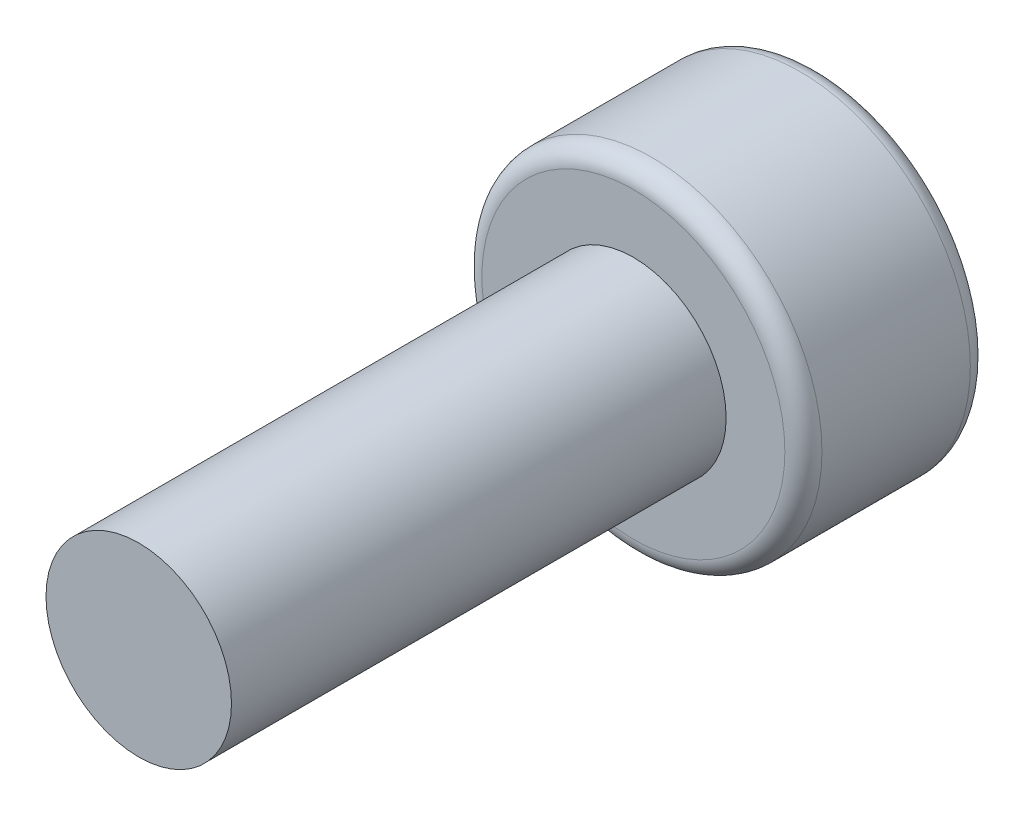
ISO-10303-21;
HEADER;
FILE_DESCRIPTION(('STEP AP214'),'2;1');
FILE_NAME('part.step','',(''),(''),'','','');
FILE_SCHEMA(('AUTOMOTIVE_DESIGN { 1 0 10303 214 1 1 1 1 }'));
ENDSEC;
DATA;
#1=APPLICATION_CONTEXT('core data for automotive mechanical design processes');
#2=APPLICATION_PROTOCOL_DEFINITION('international standard','automotive_design',2000,#1);
#3=PRODUCT_CONTEXT('',#1,'mechanical');
#4=PRODUCT('Part','Part','',(#3));
#5=PRODUCT_RELATED_PRODUCT_CATEGORY('part','',(#4));
#6=PRODUCT_DEFINITION_FORMATION('','',#4);
#7=PRODUCT_DEFINITION_CONTEXT('part definition',#1,'design');
#8=PRODUCT_DEFINITION('design','',#6,#7);
#9=PRODUCT_DEFINITION_SHAPE('','',#8);
#10=(LENGTH_UNIT() NAMED_UNIT(*) SI_UNIT(.MILLI.,.METRE.));
#11=(NAMED_UNIT(*) PLANE_ANGLE_UNIT() SI_UNIT($,.RADIAN.));
#12=(NAMED_UNIT(*) SI_UNIT($,.STERADIAN.) SOLID_ANGLE_UNIT());
#13=UNCERTAINTY_MEASURE_WITH_UNIT(LENGTH_MEASURE(1.E-05),#10,'distance_accuracy_value','');
#14=(GEOMETRIC_REPRESENTATION_CONTEXT(3) GLOBAL_UNCERTAINTY_ASSIGNED_CONTEXT((#13)) GLOBAL_UNIT_ASSIGNED_CONTEXT((#10,
#11,#12)) REPRESENTATION_CONTEXT('',''));
#15=CARTESIAN_POINT('',(0.,0.,0.));
#16=DIRECTION('',(0.,0.,1.));
#17=DIRECTION('',(1.,0.,0.));
#18=AXIS2_PLACEMENT_3D('',#15,#16,#17);
#19=CARTESIAN_POINT('',(0.,0.,3.));
#20=DIRECTION('',(0.,0.,-1.));
#21=DIRECTION('',(-1.,0.,0.));
#22=AXIS2_PLACEMENT_3D('',#19,#20,#21);
#23=CYLINDRICAL_SURFACE('',#22,2.75);
#24=CARTESIAN_POINT('',(0.,0.,0.3));
#25=DIRECTION('',(0.,0.,1.));
#26=DIRECTION('',(1.,0.,0.));
#27=AXIS2_PLACEMENT_3D('',#24,#25,#26);
#28=CIRCLE('',#27,2.75);
#29=CARTESIAN_POINT('',(2.75,0.,0.3));
#30=VERTEX_POINT('',#29);
#31=EDGE_CURVE('E155',#30,#30,#28,.T.);
#32=ORIENTED_EDGE('',*,*,#31,.T.);
#33=EDGE_LOOP('',(#32));
#34=FACE_BOUND('',#33,.T.);
#35=CARTESIAN_POINT('',(0.,0.,2.7));
#36=DIRECTION('',(0.,0.,1.));
#37=DIRECTION('',(1.,0.,0.));
#38=AXIS2_PLACEMENT_3D('',#35,#36,#37);
#39=CIRCLE('',#38,2.75);
#40=CARTESIAN_POINT('',(2.75,0.,2.7));
#41=VERTEX_POINT('',#40);
#42=EDGE_CURVE('E152',#41,#41,#39,.F.);
#43=ORIENTED_EDGE('',*,*,#42,.T.);
#44=EDGE_LOOP('',(#43));
#45=FACE_BOUND('',#44,.T.);
#46=ADVANCED_FACE('F39',(#34,#45),#23,.T.);
#47=CARTESIAN_POINT('',(0.,0.,3.));
#48=DIRECTION('',(0.,0.,1.));
#49=DIRECTION('',(1.,0.,0.));
#50=AXIS2_PLACEMENT_3D('',#47,#48,#49);
#51=PLANE('',#50);
#52=CARTESIAN_POINT('',(0.,0.,3.));
#53=DIRECTION('',(0.,0.,1.));
#54=DIRECTION('',(1.,0.,0.));
#55=AXIS2_PLACEMENT_3D('',#52,#53,#54);
#56=CIRCLE('',#55,2.45);
#57=CARTESIAN_POINT('',(2.45,0.,3.));
#58=VERTEX_POINT('',#57);
#59=EDGE_CURVE('E11',#58,#58,#56,.T.);
#60=ORIENTED_EDGE('',*,*,#59,.T.);
#61=EDGE_LOOP('',(#60));
#62=FACE_BOUND('',#61,.T.);
#63=CARTESIAN_POINT('',(0.,0.,3.));
#64=DIRECTION('',(0.,0.,1.));
#65=DIRECTION('',(1.,0.,0.));
#66=AXIS2_PLACEMENT_3D('',#63,#64,#65);
#67=CIRCLE('',#66,1.5);
#68=CARTESIAN_POINT('',(1.5,0.,3.));
#69=VERTEX_POINT('',#68);
#70=EDGE_CURVE('E149',#69,#69,#67,.T.);
#71=ORIENTED_EDGE('',*,*,#70,.F.);
#72=EDGE_LOOP('',(#71));
#73=FACE_BOUND('',#72,.T.);
#74=ADVANCED_FACE('F170',(#62,#73),#51,.T.);
#75=CARTESIAN_POINT('',(0.,0.,0.));
#76=DIRECTION('',(0.,0.,1.));
#77=DIRECTION('',(1.,0.,0.));
#78=AXIS2_PLACEMENT_3D('',#75,#76,#77);
#79=PLANE('',#78);
#80=DIRECTION('',(0.590811113127551,-0.806809908593706,0.));
#81=VECTOR('',#80,1.);
#82=CARTESIAN_POINT('',(0.820853493075304,1.8624081611757,0.));
#83=LINE('',#82,#81);
#84=CARTESIAN_POINT('',(0.820853493075304,1.8624081611757,0.));
#85=VERTEX_POINT('',#84);
#86=CARTESIAN_POINT('',(2.02331952633127,0.220324102799441,0.));
#87=VERTEX_POINT('',#86);
#88=EDGE_CURVE('E128',#85,#87,#83,.T.);
#89=ORIENTED_EDGE('',*,*,#88,.F.);
#90=DIRECTION('',(0.994123433430926,0.108252478509768,0.));
#91=VECTOR('',#90,1.);
#92=CARTESIAN_POINT('',(-1.20246603325596,1.64208405837626,0.));
#93=LINE('',#92,#91);
#94=CARTESIAN_POINT('',(-1.20246603325596,1.64208405837626,0.));
#95=VERTEX_POINT('',#94);
#96=EDGE_CURVE('E54',#95,#85,#93,.T.);
#97=ORIENTED_EDGE('',*,*,#96,.F.);
#98=DIRECTION('',(0.403312320303375,0.915062387103474,0.));
#99=VECTOR('',#98,1.);
#100=CARTESIAN_POINT('',(-2.02331952633127,-0.220324102799442,0.));
#101=LINE('',#100,#99);
#102=CARTESIAN_POINT('',(-2.02331952633127,-0.220324102799442,0.));
#103=VERTEX_POINT('',#102);
#104=EDGE_CURVE('E137',#103,#95,#101,.T.);
#105=ORIENTED_EDGE('',*,*,#104,.F.);
#106=DIRECTION('',(-0.590811113127551,0.806809908593706,0.));
#107=VECTOR('',#106,1.);
#108=CARTESIAN_POINT('',(-0.820853493075303,-1.8624081611757,0.));
#109=LINE('',#108,#107);
#110=CARTESIAN_POINT('',(-0.820853493075303,-1.8624081611757,0.));
#111=VERTEX_POINT('',#110);
#112=EDGE_CURVE('E135',#111,#103,#109,.T.);
#113=ORIENTED_EDGE('',*,*,#112,.F.);
#114=DIRECTION('',(-0.994123433430926,-0.108252478509768,0.));
#115=VECTOR('',#114,1.);
#116=CARTESIAN_POINT('',(1.20246603325596,-1.64208405837625,0.));
#117=LINE('',#116,#115);
#118=CARTESIAN_POINT('',(1.20246603325596,-1.64208405837625,0.));
#119=VERTEX_POINT('',#118);
#120=EDGE_CURVE('E102',#119,#111,#117,.T.);
#121=ORIENTED_EDGE('',*,*,#120,.F.);
#122=DIRECTION('',(-0.403312320303375,-0.915062387103474,0.));
#123=VECTOR('',#122,1.);
#124=CARTESIAN_POINT('',(2.02331952633127,0.220324102799441,0.));
#125=LINE('',#124,#123);
#126=EDGE_CURVE('E131',#87,#119,#125,.T.);
#127=ORIENTED_EDGE('',*,*,#126,.F.);
#128=EDGE_LOOP('',(#89,#97,#105,#113,#121,#127));
#129=FACE_BOUND('',#128,.T.);
#130=CARTESIAN_POINT('',(0.,0.,0.));
#131=DIRECTION('',(0.,0.,1.));
#132=DIRECTION('',(1.,0.,0.));
#133=AXIS2_PLACEMENT_3D('',#130,#131,#132);
#134=CIRCLE('',#133,2.45);
#135=CARTESIAN_POINT('',(2.45,0.,0.));
#136=VERTEX_POINT('',#135);
#137=EDGE_CURVE('E47',#136,#136,#134,.F.);
#138=ORIENTED_EDGE('',*,*,#137,.T.);
#139=EDGE_LOOP('',(#138));
#140=FACE_BOUND('',#139,.T.);
#141=ADVANCED_FACE('F160',(#129,#140),#79,.F.);
#142=CARTESIAN_POINT('',(0.,0.,11.));
#143=DIRECTION('',(0.,0.,-1.));
#144=DIRECTION('',(-1.,0.,0.));
#145=AXIS2_PLACEMENT_3D('',#142,#143,#144);
#146=CYLINDRICAL_SURFACE('',#145,1.5);
#147=CARTESIAN_POINT('',(0.,0.,11.));
#148=DIRECTION('',(0.,0.,1.));
#149=DIRECTION('',(1.,0.,0.));
#150=AXIS2_PLACEMENT_3D('',#147,#148,#149);
#151=CIRCLE('',#150,1.5);
#152=CARTESIAN_POINT('',(1.5,0.,11.));
#153=VERTEX_POINT('',#152);
#154=EDGE_CURVE('E141',#153,#153,#151,.T.);
#155=ORIENTED_EDGE('',*,*,#154,.F.);
#156=EDGE_LOOP('',(#155));
#157=FACE_BOUND('',#156,.T.);
#158=ORIENTED_EDGE('',*,*,#70,.T.);
#159=EDGE_LOOP('',(#158));
#160=FACE_BOUND('',#159,.T.);
#161=ADVANCED_FACE('F184',(#157,#160),#146,.T.);
#162=CARTESIAN_POINT('',(0.,0.,11.));
#163=DIRECTION('',(0.,0.,1.));
#164=DIRECTION('',(1.,0.,0.));
#165=AXIS2_PLACEMENT_3D('',#162,#163,#164);
#166=PLANE('',#165);
#167=ORIENTED_EDGE('',*,*,#154,.T.);
#168=EDGE_LOOP('',(#167));
#169=FACE_BOUND('',#168,.T.);
#170=ADVANCED_FACE('F165',(#169),#166,.T.);
#171=CARTESIAN_POINT('',(0.,0.,0.3));
#172=DIRECTION('',(0.,0.,1.));
#173=DIRECTION('',(1.,0.,0.));
#174=AXIS2_PLACEMENT_3D('',#171,#172,#173);
#175=TOROIDAL_SURFACE('',#174,2.45,0.3);
#176=ORIENTED_EDGE('',*,*,#137,.F.);
#177=EDGE_LOOP('',(#176));
#178=FACE_BOUND('',#177,.T.);
#179=ORIENTED_EDGE('',*,*,#31,.F.);
#180=EDGE_LOOP('',(#179));
#181=FACE_BOUND('',#180,.T.);
#182=ADVANCED_FACE('F162',(#178,#181),#175,.T.);
#183=CARTESIAN_POINT('',(0.,0.,2.7));
#184=DIRECTION('',(0.,0.,1.));
#185=DIRECTION('',(1.,0.,0.));
#186=AXIS2_PLACEMENT_3D('',#183,#184,#185);
#187=TOROIDAL_SURFACE('',#186,2.45,0.3);
#188=ORIENTED_EDGE('',*,*,#42,.F.);
#189=EDGE_LOOP('',(#188));
#190=FACE_BOUND('',#189,.T.);
#191=ORIENTED_EDGE('',*,*,#59,.F.);
#192=EDGE_LOOP('',(#191));
#193=FACE_BOUND('',#192,.T.);
#194=ADVANCED_FACE('F41',(#190,#193),#187,.T.);
#195=CARTESIAN_POINT('',(-1.20246603325596,1.64208405837626,2.));
#196=DIRECTION('',(-0.108252478509768,0.994123433430926,0.));
#197=DIRECTION('',(-0.994123433430926,-0.108252478509768,0.));
#198=AXIS2_PLACEMENT_3D('',#195,#196,#197);
#199=PLANE('',#198);
#200=ORIENTED_EDGE('',*,*,#96,.T.);
#201=DIRECTION('',(0.,0.,-1.));
#202=VECTOR('',#201,1.);
#203=CARTESIAN_POINT('',(0.820853493075304,1.8624081611757,2.));
#204=LINE('',#203,#202);
#205=CARTESIAN_POINT('',(0.820853493075304,1.8624081611757,2.));
#206=VERTEX_POINT('',#205);
#207=EDGE_CURVE('E84',#206,#85,#204,.T.);
#208=ORIENTED_EDGE('',*,*,#207,.F.);
#209=DIRECTION('',(0.994123433430926,0.108252478509768,0.));
#210=VECTOR('',#209,1.);
#211=CARTESIAN_POINT('',(-1.20246603325596,1.64208405837626,2.));
#212=LINE('',#211,#210);
#213=CARTESIAN_POINT('',(-1.20246603325596,1.64208405837626,2.));
#214=VERTEX_POINT('',#213);
#215=EDGE_CURVE('E139',#214,#206,#212,.T.);
#216=ORIENTED_EDGE('',*,*,#215,.F.);
#217=DIRECTION('',(0.,0.,-1.));
#218=VECTOR('',#217,1.);
#219=CARTESIAN_POINT('',(-1.20246603325596,1.64208405837626,2.));
#220=LINE('',#219,#218);
#221=EDGE_CURVE('E62',#214,#95,#220,.T.);
#222=ORIENTED_EDGE('',*,*,#221,.T.);
#223=EDGE_LOOP('',(#200,#208,#216,#222));
#224=FACE_BOUND('',#223,.T.);
#225=ADVANCED_FACE('F176',(#224),#199,.F.);
#226=CARTESIAN_POINT('',(-2.02331952633127,-0.220324102799442,2.));
#227=DIRECTION('',(-0.915062387103474,0.403312320303375,0.));
#228=DIRECTION('',(-0.403312320303375,-0.915062387103474,0.));
#229=AXIS2_PLACEMENT_3D('',#226,#227,#228);
#230=PLANE('',#229);
#231=ORIENTED_EDGE('',*,*,#104,.T.);
#232=ORIENTED_EDGE('',*,*,#221,.F.);
#233=DIRECTION('',(0.403312320303375,0.915062387103474,0.));
#234=VECTOR('',#233,1.);
#235=CARTESIAN_POINT('',(-2.02331952633127,-0.220324102799442,2.));
#236=LINE('',#235,#234);
#237=CARTESIAN_POINT('',(-2.02331952633127,-0.220324102799442,2.));
#238=VERTEX_POINT('',#237);
#239=EDGE_CURVE('E114',#238,#214,#236,.T.);
#240=ORIENTED_EDGE('',*,*,#239,.F.);
#241=DIRECTION('',(0.,0.,-1.));
#242=VECTOR('',#241,1.);
#243=CARTESIAN_POINT('',(-2.02331952633127,-0.220324102799442,2.));
#244=LINE('',#243,#242);
#245=EDGE_CURVE('E106',#238,#103,#244,.T.);
#246=ORIENTED_EDGE('',*,*,#245,.T.);
#247=EDGE_LOOP('',(#231,#232,#240,#246));
#248=FACE_BOUND('',#247,.T.);
#249=ADVANCED_FACE('F200',(#248),#230,.F.);
#250=CARTESIAN_POINT('',(-0.820853493075303,-1.8624081611757,2.));
#251=DIRECTION('',(-0.806809908593706,-0.590811113127551,0.));
#252=DIRECTION('',(0.590811113127551,-0.806809908593706,0.));
#253=AXIS2_PLACEMENT_3D('',#250,#251,#252);
#254=PLANE('',#253);
#255=ORIENTED_EDGE('',*,*,#112,.T.);
#256=ORIENTED_EDGE('',*,*,#245,.F.);
#257=DIRECTION('',(-0.590811113127551,0.806809908593706,0.));
#258=VECTOR('',#257,1.);
#259=CARTESIAN_POINT('',(-0.820853493075303,-1.8624081611757,2.));
#260=LINE('',#259,#258);
#261=CARTESIAN_POINT('',(-0.820853493075303,-1.8624081611757,2.));
#262=VERTEX_POINT('',#261);
#263=EDGE_CURVE('E110',#262,#238,#260,.T.);
#264=ORIENTED_EDGE('',*,*,#263,.F.);
#265=DIRECTION('',(0.,0.,-1.));
#266=VECTOR('',#265,1.);
#267=CARTESIAN_POINT('',(-0.820853493075303,-1.8624081611757,2.));
#268=LINE('',#267,#266);
#269=EDGE_CURVE('E95',#262,#111,#268,.T.);
#270=ORIENTED_EDGE('',*,*,#269,.T.);
#271=EDGE_LOOP('',(#255,#256,#264,#270));
#272=FACE_BOUND('',#271,.T.);
#273=ADVANCED_FACE('F111',(#272),#254,.F.);
#274=CARTESIAN_POINT('',(1.20246603325596,-1.64208405837625,2.));
#275=DIRECTION('',(0.108252478509768,-0.994123433430926,0.));
#276=DIRECTION('',(0.994123433430926,0.108252478509768,0.));
#277=AXIS2_PLACEMENT_3D('',#274,#275,#276);
#278=PLANE('',#277);
#279=ORIENTED_EDGE('',*,*,#120,.T.);
#280=ORIENTED_EDGE('',*,*,#269,.F.);
#281=DIRECTION('',(-0.994123433430926,-0.108252478509768,0.));
#282=VECTOR('',#281,1.);
#283=CARTESIAN_POINT('',(1.20246603325596,-1.64208405837625,2.));
#284=LINE('',#283,#282);
#285=CARTESIAN_POINT('',(1.20246603325596,-1.64208405837625,2.));
#286=VERTEX_POINT('',#285);
#287=EDGE_CURVE('E99',#286,#262,#284,.T.);
#288=ORIENTED_EDGE('',*,*,#287,.F.);
#289=DIRECTION('',(0.,0.,-1.));
#290=VECTOR('',#289,1.);
#291=CARTESIAN_POINT('',(1.20246603325596,-1.64208405837625,2.));
#292=LINE('',#291,#290);
#293=EDGE_CURVE('E107',#286,#119,#292,.T.);
#294=ORIENTED_EDGE('',*,*,#293,.T.);
#295=EDGE_LOOP('',(#279,#280,#288,#294));
#296=FACE_BOUND('',#295,.T.);
#297=ADVANCED_FACE('F97',(#296),#278,.F.);
#298=CARTESIAN_POINT('',(2.02331952633127,0.220324102799441,2.));
#299=DIRECTION('',(0.915062387103474,-0.403312320303375,0.));
#300=DIRECTION('',(0.403312320303375,0.915062387103474,0.));
#301=AXIS2_PLACEMENT_3D('',#298,#299,#300);
#302=PLANE('',#301);
#303=ORIENTED_EDGE('',*,*,#126,.T.);
#304=ORIENTED_EDGE('',*,*,#293,.F.);
#305=DIRECTION('',(-0.403312320303375,-0.915062387103474,0.));
#306=VECTOR('',#305,1.);
#307=CARTESIAN_POINT('',(2.02331952633127,0.220324102799441,2.));
#308=LINE('',#307,#306);
#309=CARTESIAN_POINT('',(2.02331952633127,0.220324102799441,2.));
#310=VERTEX_POINT('',#309);
#311=EDGE_CURVE('E120',#310,#286,#308,.T.);
#312=ORIENTED_EDGE('',*,*,#311,.F.);
#313=DIRECTION('',(0.,0.,-1.));
#314=VECTOR('',#313,1.);
#315=CARTESIAN_POINT('',(2.02331952633127,0.220324102799441,2.));
#316=LINE('',#315,#314);
#317=EDGE_CURVE('E144',#310,#87,#316,.T.);
#318=ORIENTED_EDGE('',*,*,#317,.T.);
#319=EDGE_LOOP('',(#303,#304,#312,#318));
#320=FACE_BOUND('',#319,.T.);
#321=ADVANCED_FACE('F204',(#320),#302,.F.);
#322=CARTESIAN_POINT('',(0.820853493075304,1.8624081611757,2.));
#323=DIRECTION('',(0.806809908593706,0.590811113127551,0.));
#324=DIRECTION('',(-0.590811113127551,0.806809908593706,0.));
#325=AXIS2_PLACEMENT_3D('',#322,#323,#324);
#326=PLANE('',#325);
#327=ORIENTED_EDGE('',*,*,#88,.T.);
#328=ORIENTED_EDGE('',*,*,#317,.F.);
#329=DIRECTION('',(0.590811113127551,-0.806809908593706,0.));
#330=VECTOR('',#329,1.);
#331=CARTESIAN_POINT('',(0.820853493075304,1.8624081611757,2.));
#332=LINE('',#331,#330);
#333=EDGE_CURVE('E122',#206,#310,#332,.T.);
#334=ORIENTED_EDGE('',*,*,#333,.F.);
#335=ORIENTED_EDGE('',*,*,#207,.T.);
#336=EDGE_LOOP('',(#327,#328,#334,#335));
#337=FACE_BOUND('',#336,.T.);
#338=ADVANCED_FACE('F201',(#337),#326,.F.);
#339=CARTESIAN_POINT('',(0.,0.,2.));
#340=DIRECTION('',(0.,0.,-1.));
#341=DIRECTION('',(-1.,0.,0.));
#342=AXIS2_PLACEMENT_3D('',#339,#340,#341);
#343=PLANE('',#342);
#344=ORIENTED_EDGE('',*,*,#215,.T.);
#345=ORIENTED_EDGE('',*,*,#333,.T.);
#346=ORIENTED_EDGE('',*,*,#311,.T.);
#347=ORIENTED_EDGE('',*,*,#287,.T.);
#348=ORIENTED_EDGE('',*,*,#263,.T.);
#349=ORIENTED_EDGE('',*,*,#239,.T.);
#350=EDGE_LOOP('',(#344,#345,#346,#347,#348,#349));
#351=FACE_BOUND('',#350,.T.);
#352=ADVANCED_FACE('F117',(#351),#343,.T.);
#353=CLOSED_SHELL('',(#46,#74,#141,#161,#170,#182,#194,#225,#249,#273,#297,#321,#338,#352));
#354=MANIFOLD_SOLID_BREP('B2',#353);
#355=ADVANCED_BREP_SHAPE_REPRESENTATION('',(#18,#354),#14);
#356=SHAPE_DEFINITION_REPRESENTATION(#9,#355);
ENDSEC;
END-ISO-10303-21;
